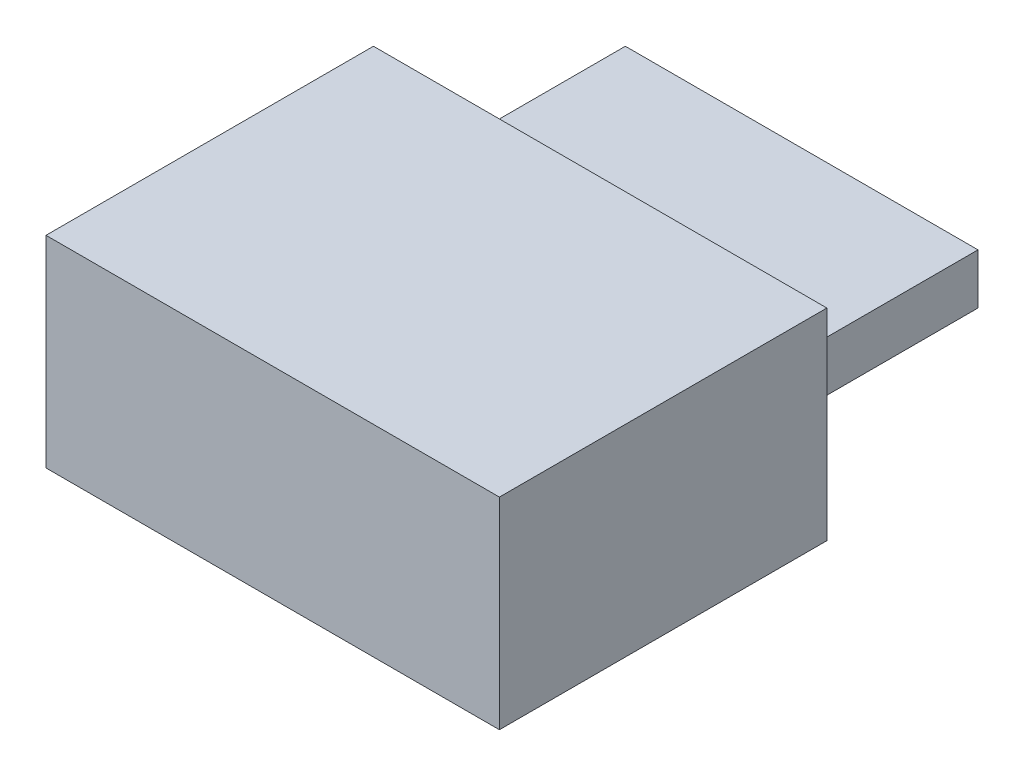
ISO-10303-21;
HEADER;
FILE_DESCRIPTION(('STEP AP214'),'2;1');
FILE_NAME('part.step','',(''),(''),'','','');
FILE_SCHEMA(('AUTOMOTIVE_DESIGN { 1 0 10303 214 1 1 1 1 }'));
ENDSEC;
DATA;
#1=APPLICATION_CONTEXT('core data for automotive mechanical design processes');
#2=APPLICATION_PROTOCOL_DEFINITION('international standard','automotive_design',2000,#1);
#3=PRODUCT_CONTEXT('',#1,'mechanical');
#4=PRODUCT('Part','Part','',(#3));
#5=PRODUCT_RELATED_PRODUCT_CATEGORY('part','',(#4));
#6=PRODUCT_DEFINITION_FORMATION('','',#4);
#7=PRODUCT_DEFINITION_CONTEXT('part definition',#1,'design');
#8=PRODUCT_DEFINITION('design','',#6,#7);
#9=PRODUCT_DEFINITION_SHAPE('','',#8);
#10=(LENGTH_UNIT() NAMED_UNIT(*) SI_UNIT(.MILLI.,.METRE.));
#11=(NAMED_UNIT(*) PLANE_ANGLE_UNIT() SI_UNIT($,.RADIAN.));
#12=(NAMED_UNIT(*) SI_UNIT($,.STERADIAN.) SOLID_ANGLE_UNIT());
#13=UNCERTAINTY_MEASURE_WITH_UNIT(LENGTH_MEASURE(1.E-05),#10,'distance_accuracy_value','');
#14=(GEOMETRIC_REPRESENTATION_CONTEXT(3) GLOBAL_UNCERTAINTY_ASSIGNED_CONTEXT((#13)) GLOBAL_UNIT_ASSIGNED_CONTEXT((#10,
#11,#12)) REPRESENTATION_CONTEXT('',''));
#15=CARTESIAN_POINT('',(0.,0.,0.));
#16=DIRECTION('',(0.,0.,1.));
#17=DIRECTION('',(1.,0.,0.));
#18=AXIS2_PLACEMENT_3D('',#15,#16,#17);
#19=CARTESIAN_POINT('',(0.,0.,-3.25));
#20=DIRECTION('',(0.,0.,-1.));
#21=DIRECTION('',(-1.,0.,0.));
#22=AXIS2_PLACEMENT_3D('',#19,#20,#21);
#23=PLANE('',#22);
#24=DIRECTION('',(0.,1.,0.));
#25=VECTOR('',#24,1.);
#26=CARTESIAN_POINT('',(4.5,-2.,-3.25));
#27=LINE('',#26,#25);
#28=CARTESIAN_POINT('',(4.5,-2.,-3.25));
#29=VERTEX_POINT('',#28);
#30=CARTESIAN_POINT('',(4.5,2.,-3.25));
#31=VERTEX_POINT('',#30);
#32=EDGE_CURVE('E132',#29,#31,#27,.T.);
#33=ORIENTED_EDGE('',*,*,#32,.F.);
#34=DIRECTION('',(1.,0.,0.));
#35=VECTOR('',#34,1.);
#36=CARTESIAN_POINT('',(-4.5,-2.,-3.25));
#37=LINE('',#36,#35);
#38=CARTESIAN_POINT('',(-4.5,-2.,-3.25));
#39=VERTEX_POINT('',#38);
#40=EDGE_CURVE('E78',#39,#29,#37,.T.);
#41=ORIENTED_EDGE('',*,*,#40,.F.);
#42=DIRECTION('',(0.,-1.,0.));
#43=VECTOR('',#42,1.);
#44=CARTESIAN_POINT('',(-4.5,-2.,-3.25));
#45=LINE('',#44,#43);
#46=CARTESIAN_POINT('',(-4.5,2.,-3.25));
#47=VERTEX_POINT('',#46);
#48=EDGE_CURVE('E148',#47,#39,#45,.T.);
#49=ORIENTED_EDGE('',*,*,#48,.F.);
#50=DIRECTION('',(-1.,0.,0.));
#51=VECTOR('',#50,1.);
#52=CARTESIAN_POINT('',(-4.5,2.,-3.25));
#53=LINE('',#52,#51);
#54=EDGE_CURVE('E135',#31,#47,#53,.T.);
#55=ORIENTED_EDGE('',*,*,#54,.F.);
#56=EDGE_LOOP('',(#33,#41,#49,#55));
#57=FACE_BOUND('',#56,.T.);
#58=DIRECTION('',(1.,0.,0.));
#59=VECTOR('',#58,1.);
#60=CARTESIAN_POINT('',(3.5,0.5,-3.25));
#61=LINE('',#60,#59);
#62=CARTESIAN_POINT('',(-3.5,0.5,-3.25));
#63=VERTEX_POINT('',#62);
#64=CARTESIAN_POINT('',(3.5,0.5,-3.25));
#65=VERTEX_POINT('',#64);
#66=EDGE_CURVE('E263',#63,#65,#61,.T.);
#67=ORIENTED_EDGE('',*,*,#66,.F.);
#68=DIRECTION('',(0.,1.,0.));
#69=VECTOR('',#68,1.);
#70=CARTESIAN_POINT('',(-3.5,-0.5,-3.25));
#71=LINE('',#70,#69);
#72=CARTESIAN_POINT('',(-3.5,-0.5,-3.25));
#73=VERTEX_POINT('',#72);
#74=EDGE_CURVE('E130',#73,#63,#71,.T.);
#75=ORIENTED_EDGE('',*,*,#74,.F.);
#76=DIRECTION('',(-1.,0.,0.));
#77=VECTOR('',#76,1.);
#78=CARTESIAN_POINT('',(3.5,-0.5,-3.25));
#79=LINE('',#78,#77);
#80=CARTESIAN_POINT('',(3.5,-0.5,-3.25));
#81=VERTEX_POINT('',#80);
#82=EDGE_CURVE('E126',#81,#73,#79,.T.);
#83=ORIENTED_EDGE('',*,*,#82,.F.);
#84=DIRECTION('',(0.,-1.,0.));
#85=VECTOR('',#84,1.);
#86=CARTESIAN_POINT('',(3.5,-0.5,-3.25));
#87=LINE('',#86,#85);
#88=EDGE_CURVE('E260',#65,#81,#87,.T.);
#89=ORIENTED_EDGE('',*,*,#88,.F.);
#90=EDGE_LOOP('',(#67,#75,#83,#89));
#91=FACE_BOUND('',#90,.T.);
#92=ADVANCED_FACE('F33',(#57,#91),#23,.T.);
#93=CARTESIAN_POINT('',(4.5,-2.,3.25));
#94=DIRECTION('',(-1.,0.,0.));
#95=DIRECTION('',(0.,0.,1.));
#96=AXIS2_PLACEMENT_3D('',#93,#94,#95);
#97=PLANE('',#96);
#98=ORIENTED_EDGE('',*,*,#32,.T.);
#99=DIRECTION('',(0.,0.,-1.));
#100=VECTOR('',#99,1.);
#101=CARTESIAN_POINT('',(4.5,2.,3.25));
#102=LINE('',#101,#100);
#103=CARTESIAN_POINT('',(4.5,2.,3.25));
#104=VERTEX_POINT('',#103);
#105=EDGE_CURVE('E11',#104,#31,#102,.T.);
#106=ORIENTED_EDGE('',*,*,#105,.F.);
#107=DIRECTION('',(0.,1.,0.));
#108=VECTOR('',#107,1.);
#109=CARTESIAN_POINT('',(4.5,-2.,3.25));
#110=LINE('',#109,#108);
#111=CARTESIAN_POINT('',(4.5,-2.,3.25));
#112=VERTEX_POINT('',#111);
#113=EDGE_CURVE('E140',#112,#104,#110,.T.);
#114=ORIENTED_EDGE('',*,*,#113,.F.);
#115=DIRECTION('',(0.,0.,-1.));
#116=VECTOR('',#115,1.);
#117=CARTESIAN_POINT('',(4.5,-2.,3.25));
#118=LINE('',#117,#116);
#119=EDGE_CURVE('E145',#112,#29,#118,.T.);
#120=ORIENTED_EDGE('',*,*,#119,.T.);
#121=EDGE_LOOP('',(#98,#106,#114,#120));
#122=FACE_BOUND('',#121,.T.);
#123=ADVANCED_FACE('F35',(#122),#97,.F.);
#124=CARTESIAN_POINT('',(-4.5,2.,3.25));
#125=DIRECTION('',(0.,-1.,0.));
#126=DIRECTION('',(0.,0.,-1.));
#127=AXIS2_PLACEMENT_3D('',#124,#125,#126);
#128=PLANE('',#127);
#129=ORIENTED_EDGE('',*,*,#54,.T.);
#130=DIRECTION('',(0.,0.,-1.));
#131=VECTOR('',#130,1.);
#132=CARTESIAN_POINT('',(-4.5,2.,3.25));
#133=LINE('',#132,#131);
#134=CARTESIAN_POINT('',(-4.5,2.,3.25));
#135=VERTEX_POINT('',#134);
#136=EDGE_CURVE('E41',#135,#47,#133,.T.);
#137=ORIENTED_EDGE('',*,*,#136,.F.);
#138=DIRECTION('',(-1.,0.,0.));
#139=VECTOR('',#138,1.);
#140=CARTESIAN_POINT('',(-4.5,2.,3.25));
#141=LINE('',#140,#139);
#142=EDGE_CURVE('E85',#104,#135,#141,.T.);
#143=ORIENTED_EDGE('',*,*,#142,.F.);
#144=ORIENTED_EDGE('',*,*,#105,.T.);
#145=EDGE_LOOP('',(#129,#137,#143,#144));
#146=FACE_BOUND('',#145,.T.);
#147=ADVANCED_FACE('F174',(#146),#128,.F.);
#148=CARTESIAN_POINT('',(-4.5,-2.,3.25));
#149=DIRECTION('',(1.,0.,0.));
#150=DIRECTION('',(0.,0.,-1.));
#151=AXIS2_PLACEMENT_3D('',#148,#149,#150);
#152=PLANE('',#151);
#153=ORIENTED_EDGE('',*,*,#48,.T.);
#154=DIRECTION('',(0.,0.,-1.));
#155=VECTOR('',#154,1.);
#156=CARTESIAN_POINT('',(-4.5,-2.,3.25));
#157=LINE('',#156,#155);
#158=CARTESIAN_POINT('',(-4.5,-2.,3.25));
#159=VERTEX_POINT('',#158);
#160=EDGE_CURVE('E152',#159,#39,#157,.T.);
#161=ORIENTED_EDGE('',*,*,#160,.F.);
#162=DIRECTION('',(0.,-1.,0.));
#163=VECTOR('',#162,1.);
#164=CARTESIAN_POINT('',(-4.5,-2.,3.25));
#165=LINE('',#164,#163);
#166=EDGE_CURVE('E143',#135,#159,#165,.T.);
#167=ORIENTED_EDGE('',*,*,#166,.F.);
#168=ORIENTED_EDGE('',*,*,#136,.T.);
#169=EDGE_LOOP('',(#153,#161,#167,#168));
#170=FACE_BOUND('',#169,.T.);
#171=ADVANCED_FACE('F157',(#170),#152,.F.);
#172=CARTESIAN_POINT('',(-4.5,-2.,3.25));
#173=DIRECTION('',(0.,1.,0.));
#174=DIRECTION('',(0.,0.,1.));
#175=AXIS2_PLACEMENT_3D('',#172,#173,#174);
#176=PLANE('',#175);
#177=ORIENTED_EDGE('',*,*,#40,.T.);
#178=ORIENTED_EDGE('',*,*,#119,.F.);
#179=DIRECTION('',(1.,0.,0.));
#180=VECTOR('',#179,1.);
#181=CARTESIAN_POINT('',(-4.5,-2.,3.25));
#182=LINE('',#181,#180);
#183=EDGE_CURVE('E57',#159,#112,#182,.T.);
#184=ORIENTED_EDGE('',*,*,#183,.F.);
#185=ORIENTED_EDGE('',*,*,#160,.T.);
#186=EDGE_LOOP('',(#177,#178,#184,#185));
#187=FACE_BOUND('',#186,.T.);
#188=ADVANCED_FACE('F165',(#187),#176,.F.);
#189=CARTESIAN_POINT('',(0.,0.,3.25));
#190=DIRECTION('',(0.,0.,-1.));
#191=DIRECTION('',(-1.,0.,0.));
#192=AXIS2_PLACEMENT_3D('',#189,#190,#191);
#193=PLANE('',#192);
#194=ORIENTED_EDGE('',*,*,#113,.T.);
#195=ORIENTED_EDGE('',*,*,#142,.T.);
#196=ORIENTED_EDGE('',*,*,#166,.T.);
#197=ORIENTED_EDGE('',*,*,#183,.T.);
#198=EDGE_LOOP('',(#194,#195,#196,#197));
#199=FACE_BOUND('',#198,.T.);
#200=ADVANCED_FACE('F167',(#199),#193,.F.);
#201=CARTESIAN_POINT('',(-3.5,-0.5,-7.25));
#202=DIRECTION('',(1.,0.,0.));
#203=DIRECTION('',(0.,0.,-1.));
#204=AXIS2_PLACEMENT_3D('',#201,#202,#203);
#205=PLANE('',#204);
#206=ORIENTED_EDGE('',*,*,#74,.T.);
#207=DIRECTION('',(0.,0.,1.));
#208=VECTOR('',#207,1.);
#209=CARTESIAN_POINT('',(-3.5,0.5,-7.25));
#210=LINE('',#209,#208);
#211=CARTESIAN_POINT('',(-3.5,0.5,-7.25));
#212=VERTEX_POINT('',#211);
#213=EDGE_CURVE('E111',#212,#63,#210,.T.);
#214=ORIENTED_EDGE('',*,*,#213,.F.);
#215=DIRECTION('',(0.,1.,0.));
#216=VECTOR('',#215,1.);
#217=CARTESIAN_POINT('',(-3.5,-0.5,-7.25));
#218=LINE('',#217,#216);
#219=CARTESIAN_POINT('',(-3.5,-0.5,-7.25));
#220=VERTEX_POINT('',#219);
#221=EDGE_CURVE('E118',#220,#212,#218,.T.);
#222=ORIENTED_EDGE('',*,*,#221,.F.);
#223=DIRECTION('',(0.,0.,1.));
#224=VECTOR('',#223,1.);
#225=CARTESIAN_POINT('',(-3.5,-0.5,-7.25));
#226=LINE('',#225,#224);
#227=EDGE_CURVE('E258',#220,#73,#226,.T.);
#228=ORIENTED_EDGE('',*,*,#227,.T.);
#229=EDGE_LOOP('',(#206,#214,#222,#228));
#230=FACE_BOUND('',#229,.T.);
#231=ADVANCED_FACE('F128',(#230),#205,.F.);
#232=CARTESIAN_POINT('',(3.5,0.5,-7.25));
#233=DIRECTION('',(0.,-1.,0.));
#234=DIRECTION('',(0.,0.,-1.));
#235=AXIS2_PLACEMENT_3D('',#232,#233,#234);
#236=PLANE('',#235);
#237=ORIENTED_EDGE('',*,*,#66,.T.);
#238=DIRECTION('',(0.,0.,1.));
#239=VECTOR('',#238,1.);
#240=CARTESIAN_POINT('',(3.5,0.5,-7.25));
#241=LINE('',#240,#239);
#242=CARTESIAN_POINT('',(3.5,0.5,-7.25));
#243=VERTEX_POINT('',#242);
#244=EDGE_CURVE('E114',#243,#65,#241,.T.);
#245=ORIENTED_EDGE('',*,*,#244,.F.);
#246=DIRECTION('',(1.,0.,0.));
#247=VECTOR('',#246,1.);
#248=CARTESIAN_POINT('',(3.5,0.5,-7.25));
#249=LINE('',#248,#247);
#250=EDGE_CURVE('E107',#212,#243,#249,.T.);
#251=ORIENTED_EDGE('',*,*,#250,.F.);
#252=ORIENTED_EDGE('',*,*,#213,.T.);
#253=EDGE_LOOP('',(#237,#245,#251,#252));
#254=FACE_BOUND('',#253,.T.);
#255=ADVANCED_FACE('F109',(#254),#236,.F.);
#256=CARTESIAN_POINT('',(3.5,-0.5,-7.25));
#257=DIRECTION('',(-1.,0.,0.));
#258=DIRECTION('',(0.,0.,1.));
#259=AXIS2_PLACEMENT_3D('',#256,#257,#258);
#260=PLANE('',#259);
#261=ORIENTED_EDGE('',*,*,#88,.T.);
#262=DIRECTION('',(0.,0.,1.));
#263=VECTOR('',#262,1.);
#264=CARTESIAN_POINT('',(3.5,-0.5,-7.25));
#265=LINE('',#264,#263);
#266=CARTESIAN_POINT('',(3.5,-0.5,-7.25));
#267=VERTEX_POINT('',#266);
#268=EDGE_CURVE('E48',#267,#81,#265,.T.);
#269=ORIENTED_EDGE('',*,*,#268,.F.);
#270=DIRECTION('',(0.,-1.,0.));
#271=VECTOR('',#270,1.);
#272=CARTESIAN_POINT('',(3.5,-0.5,-7.25));
#273=LINE('',#272,#271);
#274=EDGE_CURVE('E117',#243,#267,#273,.T.);
#275=ORIENTED_EDGE('',*,*,#274,.F.);
#276=ORIENTED_EDGE('',*,*,#244,.T.);
#277=EDGE_LOOP('',(#261,#269,#275,#276));
#278=FACE_BOUND('',#277,.T.);
#279=ADVANCED_FACE('F186',(#278),#260,.F.);
#280=CARTESIAN_POINT('',(3.5,-0.5,-7.25));
#281=DIRECTION('',(0.,1.,0.));
#282=DIRECTION('',(0.,0.,1.));
#283=AXIS2_PLACEMENT_3D('',#280,#281,#282);
#284=PLANE('',#283);
#285=ORIENTED_EDGE('',*,*,#82,.T.);
#286=ORIENTED_EDGE('',*,*,#227,.F.);
#287=DIRECTION('',(-1.,0.,0.));
#288=VECTOR('',#287,1.);
#289=CARTESIAN_POINT('',(3.5,-0.5,-7.25));
#290=LINE('',#289,#288);
#291=EDGE_CURVE('E122',#267,#220,#290,.T.);
#292=ORIENTED_EDGE('',*,*,#291,.F.);
#293=ORIENTED_EDGE('',*,*,#268,.T.);
#294=EDGE_LOOP('',(#285,#286,#292,#293));
#295=FACE_BOUND('',#294,.T.);
#296=ADVANCED_FACE('F189',(#295),#284,.F.);
#297=CARTESIAN_POINT('',(0.,0.,-7.25));
#298=DIRECTION('',(0.,0.,1.));
#299=DIRECTION('',(1.,0.,0.));
#300=AXIS2_PLACEMENT_3D('',#297,#298,#299);
#301=PLANE('',#300);
#302=ORIENTED_EDGE('',*,*,#221,.T.);
#303=ORIENTED_EDGE('',*,*,#250,.T.);
#304=ORIENTED_EDGE('',*,*,#274,.T.);
#305=ORIENTED_EDGE('',*,*,#291,.T.);
#306=EDGE_LOOP('',(#302,#303,#304,#305));
#307=FACE_BOUND('',#306,.T.);
#308=ADVANCED_FACE('F121',(#307),#301,.F.);
#309=CLOSED_SHELL('',(#92,#123,#147,#171,#188,#200,#231,#255,#279,#296,#308));
#310=MANIFOLD_SOLID_BREP('B2',#309);
#311=ADVANCED_BREP_SHAPE_REPRESENTATION('',(#18,#310),#14);
#312=SHAPE_DEFINITION_REPRESENTATION(#9,#311);
ENDSEC;
END-ISO-10303-21;
